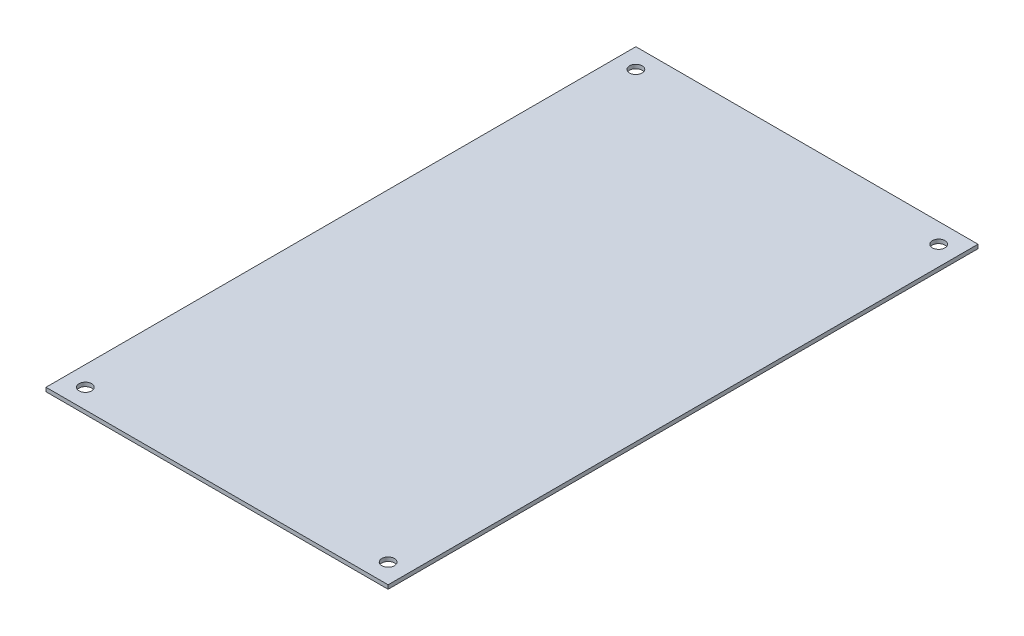
ISO-10303-21;
HEADER;
FILE_DESCRIPTION(('STEP AP214'),'2;1');
FILE_NAME('part.step','',(''),(''),'','','');
FILE_SCHEMA(('AUTOMOTIVE_DESIGN { 1 0 10303 214 1 1 1 1 }'));
ENDSEC;
DATA;
#1=APPLICATION_CONTEXT('core data for automotive mechanical design processes');
#2=APPLICATION_PROTOCOL_DEFINITION('international standard','automotive_design',2000,#1);
#3=PRODUCT_CONTEXT('',#1,'mechanical');
#4=PRODUCT('Part','Part','',(#3));
#5=PRODUCT_RELATED_PRODUCT_CATEGORY('part','',(#4));
#6=PRODUCT_DEFINITION_FORMATION('','',#4);
#7=PRODUCT_DEFINITION_CONTEXT('part definition',#1,'design');
#8=PRODUCT_DEFINITION('design','',#6,#7);
#9=PRODUCT_DEFINITION_SHAPE('','',#8);
#10=(LENGTH_UNIT() NAMED_UNIT(*) SI_UNIT(.MILLI.,.METRE.));
#11=(NAMED_UNIT(*) PLANE_ANGLE_UNIT() SI_UNIT($,.RADIAN.));
#12=(NAMED_UNIT(*) SI_UNIT($,.STERADIAN.) SOLID_ANGLE_UNIT());
#13=UNCERTAINTY_MEASURE_WITH_UNIT(LENGTH_MEASURE(1.E-05),#10,'distance_accuracy_value','');
#14=(GEOMETRIC_REPRESENTATION_CONTEXT(3) GLOBAL_UNCERTAINTY_ASSIGNED_CONTEXT((#13)) GLOBAL_UNIT_ASSIGNED_CONTEXT((#10,
#11,#12)) REPRESENTATION_CONTEXT('',''));
#15=CARTESIAN_POINT('',(0.,0.,0.));
#16=DIRECTION('',(0.,0.,1.));
#17=DIRECTION('',(1.,0.,0.));
#18=AXIS2_PLACEMENT_3D('',#15,#16,#17);
#19=CARTESIAN_POINT('',(-43.5,1.,0.));
#20=DIRECTION('',(-1.,0.,0.));
#21=DIRECTION('',(0.,0.,1.));
#22=AXIS2_PLACEMENT_3D('',#19,#20,#21);
#23=PLANE('',#22);
#24=DIRECTION('',(0.,0.,-1.));
#25=VECTOR('',#24,1.);
#26=CARTESIAN_POINT('',(-43.5,0.,0.));
#27=LINE('',#26,#25);
#28=CARTESIAN_POINT('',(-43.5,0.,75.));
#29=VERTEX_POINT('',#28);
#30=CARTESIAN_POINT('',(-43.5,0.,-75.));
#31=VERTEX_POINT('',#30);
#32=EDGE_CURVE('E114',#29,#31,#27,.T.);
#33=ORIENTED_EDGE('',*,*,#32,.F.);
#34=DIRECTION('',(0.,-1.,0.));
#35=VECTOR('',#34,1.);
#36=CARTESIAN_POINT('',(-43.5,1.,75.));
#37=LINE('',#36,#35);
#38=CARTESIAN_POINT('',(-43.5,1.,75.));
#39=VERTEX_POINT('',#38);
#40=EDGE_CURVE('E11',#39,#29,#37,.T.);
#41=ORIENTED_EDGE('',*,*,#40,.F.);
#42=DIRECTION('',(0.,0.,-1.));
#43=VECTOR('',#42,1.);
#44=CARTESIAN_POINT('',(-43.5,1.,0.));
#45=LINE('',#44,#43);
#46=CARTESIAN_POINT('',(-43.5,1.,-75.));
#47=VERTEX_POINT('',#46);
#48=EDGE_CURVE('E98',#39,#47,#45,.T.);
#49=ORIENTED_EDGE('',*,*,#48,.T.);
#50=DIRECTION('',(0.,-1.,0.));
#51=VECTOR('',#50,1.);
#52=CARTESIAN_POINT('',(-43.5,1.,-75.));
#53=LINE('',#52,#51);
#54=EDGE_CURVE('E60',#47,#31,#53,.T.);
#55=ORIENTED_EDGE('',*,*,#54,.T.);
#56=EDGE_LOOP('',(#33,#41,#49,#55));
#57=FACE_BOUND('',#56,.T.);
#58=ADVANCED_FACE('F43',(#57),#23,.T.);
#59=CARTESIAN_POINT('',(0.,1.,75.));
#60=DIRECTION('',(0.,0.,-1.));
#61=DIRECTION('',(-1.,0.,0.));
#62=AXIS2_PLACEMENT_3D('',#59,#60,#61);
#63=PLANE('',#62);
#64=DIRECTION('',(1.,0.,0.));
#65=VECTOR('',#64,1.);
#66=CARTESIAN_POINT('',(0.,0.,75.));
#67=LINE('',#66,#65);
#68=CARTESIAN_POINT('',(43.5,0.,75.));
#69=VERTEX_POINT('',#68);
#70=EDGE_CURVE('E103',#29,#69,#67,.T.);
#71=ORIENTED_EDGE('',*,*,#70,.T.);
#72=DIRECTION('',(0.,-1.,0.));
#73=VECTOR('',#72,1.);
#74=CARTESIAN_POINT('',(43.5,1.,75.));
#75=LINE('',#74,#73);
#76=CARTESIAN_POINT('',(43.5,1.,75.));
#77=VERTEX_POINT('',#76);
#78=EDGE_CURVE('E52',#77,#69,#75,.T.);
#79=ORIENTED_EDGE('',*,*,#78,.F.);
#80=DIRECTION('',(1.,0.,0.));
#81=VECTOR('',#80,1.);
#82=CARTESIAN_POINT('',(0.,1.,75.));
#83=LINE('',#82,#81);
#84=EDGE_CURVE('E94',#39,#77,#83,.T.);
#85=ORIENTED_EDGE('',*,*,#84,.F.);
#86=ORIENTED_EDGE('',*,*,#40,.T.);
#87=EDGE_LOOP('',(#71,#79,#85,#86));
#88=FACE_BOUND('',#87,.T.);
#89=ADVANCED_FACE('F101',(#88),#63,.F.);
#90=CARTESIAN_POINT('',(43.5,1.,0.));
#91=DIRECTION('',(-1.,0.,0.));
#92=DIRECTION('',(0.,0.,1.));
#93=AXIS2_PLACEMENT_3D('',#90,#91,#92);
#94=PLANE('',#93);
#95=DIRECTION('',(0.,0.,-1.));
#96=VECTOR('',#95,1.);
#97=CARTESIAN_POINT('',(43.5,0.,0.));
#98=LINE('',#97,#96);
#99=CARTESIAN_POINT('',(43.5,0.,-75.));
#100=VERTEX_POINT('',#99);
#101=EDGE_CURVE('E111',#69,#100,#98,.T.);
#102=ORIENTED_EDGE('',*,*,#101,.T.);
#103=DIRECTION('',(0.,-1.,0.));
#104=VECTOR('',#103,1.);
#105=CARTESIAN_POINT('',(43.5,1.,-75.));
#106=LINE('',#105,#104);
#107=CARTESIAN_POINT('',(43.5,1.,-75.));
#108=VERTEX_POINT('',#107);
#109=EDGE_CURVE('E74',#108,#100,#106,.T.);
#110=ORIENTED_EDGE('',*,*,#109,.F.);
#111=DIRECTION('',(0.,0.,-1.));
#112=VECTOR('',#111,1.);
#113=CARTESIAN_POINT('',(43.5,1.,0.));
#114=LINE('',#113,#112);
#115=EDGE_CURVE('E86',#77,#108,#114,.T.);
#116=ORIENTED_EDGE('',*,*,#115,.F.);
#117=ORIENTED_EDGE('',*,*,#78,.T.);
#118=EDGE_LOOP('',(#102,#110,#116,#117));
#119=FACE_BOUND('',#118,.T.);
#120=ADVANCED_FACE('F88',(#119),#94,.F.);
#121=CARTESIAN_POINT('',(-38.5,1.,-70.));
#122=DIRECTION('',(0.,-1.,0.));
#123=DIRECTION('',(0.,0.,-1.));
#124=AXIS2_PLACEMENT_3D('',#121,#122,#123);
#125=CYLINDRICAL_SURFACE('',#124,1.6);
#126=CARTESIAN_POINT('',(-38.5,1.,-70.));
#127=DIRECTION('',(0.,1.,0.));
#128=DIRECTION('',(0.,0.,1.));
#129=AXIS2_PLACEMENT_3D('',#126,#127,#128);
#130=CIRCLE('',#129,1.6);
#131=CARTESIAN_POINT('',(-38.5,1.,-68.4));
#132=VERTEX_POINT('',#131);
#133=EDGE_CURVE('E130',#132,#132,#130,.T.);
#134=ORIENTED_EDGE('',*,*,#133,.T.);
#135=EDGE_LOOP('',(#134));
#136=FACE_BOUND('',#135,.T.);
#137=CARTESIAN_POINT('',(-38.5,0.,-70.));
#138=DIRECTION('',(0.,1.,0.));
#139=DIRECTION('',(0.,0.,1.));
#140=AXIS2_PLACEMENT_3D('',#137,#138,#139);
#141=CIRCLE('',#140,1.6);
#142=CARTESIAN_POINT('',(-38.5,0.,-68.4));
#143=VERTEX_POINT('',#142);
#144=EDGE_CURVE('E116',#143,#143,#141,.T.);
#145=ORIENTED_EDGE('',*,*,#144,.F.);
#146=EDGE_LOOP('',(#145));
#147=FACE_BOUND('',#146,.T.);
#148=ADVANCED_FACE('F155',(#136,#147),#125,.F.);
#149=CARTESIAN_POINT('',(-38.5,1.,70.));
#150=DIRECTION('',(0.,-1.,0.));
#151=DIRECTION('',(0.,0.,-1.));
#152=AXIS2_PLACEMENT_3D('',#149,#150,#151);
#153=CYLINDRICAL_SURFACE('',#152,1.6);
#154=CARTESIAN_POINT('',(-38.5,1.,70.));
#155=DIRECTION('',(0.,1.,0.));
#156=DIRECTION('',(0.,0.,1.));
#157=AXIS2_PLACEMENT_3D('',#154,#155,#156);
#158=CIRCLE('',#157,1.6);
#159=CARTESIAN_POINT('',(-38.5,1.,71.6));
#160=VERTEX_POINT('',#159);
#161=EDGE_CURVE('E133',#160,#160,#158,.T.);
#162=ORIENTED_EDGE('',*,*,#161,.T.);
#163=EDGE_LOOP('',(#162));
#164=FACE_BOUND('',#163,.T.);
#165=CARTESIAN_POINT('',(-38.5,0.,70.));
#166=DIRECTION('',(0.,1.,0.));
#167=DIRECTION('',(0.,0.,1.));
#168=AXIS2_PLACEMENT_3D('',#165,#166,#167);
#169=CIRCLE('',#168,1.6);
#170=CARTESIAN_POINT('',(-38.5,0.,71.6));
#171=VERTEX_POINT('',#170);
#172=EDGE_CURVE('E119',#171,#171,#169,.T.);
#173=ORIENTED_EDGE('',*,*,#172,.F.);
#174=EDGE_LOOP('',(#173));
#175=FACE_BOUND('',#174,.T.);
#176=ADVANCED_FACE('F158',(#164,#175),#153,.F.);
#177=CARTESIAN_POINT('',(38.5,1.,-70.));
#178=DIRECTION('',(0.,-1.,0.));
#179=DIRECTION('',(0.,0.,-1.));
#180=AXIS2_PLACEMENT_3D('',#177,#178,#179);
#181=CYLINDRICAL_SURFACE('',#180,1.6);
#182=CARTESIAN_POINT('',(38.5,1.,-70.));
#183=DIRECTION('',(0.,1.,0.));
#184=DIRECTION('',(0.,0.,1.));
#185=AXIS2_PLACEMENT_3D('',#182,#183,#184);
#186=CIRCLE('',#185,1.6);
#187=CARTESIAN_POINT('',(38.5,1.,-68.4));
#188=VERTEX_POINT('',#187);
#189=EDGE_CURVE('E136',#188,#188,#186,.T.);
#190=ORIENTED_EDGE('',*,*,#189,.T.);
#191=EDGE_LOOP('',(#190));
#192=FACE_BOUND('',#191,.T.);
#193=CARTESIAN_POINT('',(38.5,0.,-70.));
#194=DIRECTION('',(0.,1.,0.));
#195=DIRECTION('',(0.,0.,1.));
#196=AXIS2_PLACEMENT_3D('',#193,#194,#195);
#197=CIRCLE('',#196,1.6);
#198=CARTESIAN_POINT('',(38.5,0.,-68.4));
#199=VERTEX_POINT('',#198);
#200=EDGE_CURVE('E122',#199,#199,#197,.T.);
#201=ORIENTED_EDGE('',*,*,#200,.F.);
#202=EDGE_LOOP('',(#201));
#203=FACE_BOUND('',#202,.T.);
#204=ADVANCED_FACE('F171',(#192,#203),#181,.F.);
#205=CARTESIAN_POINT('',(38.5,1.,70.));
#206=DIRECTION('',(0.,-1.,0.));
#207=DIRECTION('',(0.,0.,-1.));
#208=AXIS2_PLACEMENT_3D('',#205,#206,#207);
#209=CYLINDRICAL_SURFACE('',#208,1.6);
#210=CARTESIAN_POINT('',(38.5,1.,70.));
#211=DIRECTION('',(0.,1.,0.));
#212=DIRECTION('',(0.,0.,1.));
#213=AXIS2_PLACEMENT_3D('',#210,#211,#212);
#214=CIRCLE('',#213,1.6);
#215=CARTESIAN_POINT('',(38.5,1.,71.6));
#216=VERTEX_POINT('',#215);
#217=EDGE_CURVE('E110',#216,#216,#214,.T.);
#218=ORIENTED_EDGE('',*,*,#217,.T.);
#219=EDGE_LOOP('',(#218));
#220=FACE_BOUND('',#219,.T.);
#221=CARTESIAN_POINT('',(38.5,0.,70.));
#222=DIRECTION('',(0.,1.,0.));
#223=DIRECTION('',(0.,0.,1.));
#224=AXIS2_PLACEMENT_3D('',#221,#222,#223);
#225=CIRCLE('',#224,1.6);
#226=CARTESIAN_POINT('',(38.5,0.,71.6));
#227=VERTEX_POINT('',#226);
#228=EDGE_CURVE('E125',#227,#227,#225,.T.);
#229=ORIENTED_EDGE('',*,*,#228,.F.);
#230=EDGE_LOOP('',(#229));
#231=FACE_BOUND('',#230,.T.);
#232=ADVANCED_FACE('F45',(#220,#231),#209,.F.);
#233=CARTESIAN_POINT('',(0.,1.,-75.));
#234=DIRECTION('',(0.,0.,-1.));
#235=DIRECTION('',(-1.,0.,0.));
#236=AXIS2_PLACEMENT_3D('',#233,#234,#235);
#237=PLANE('',#236);
#238=DIRECTION('',(1.,0.,0.));
#239=VECTOR('',#238,1.);
#240=CARTESIAN_POINT('',(0.,0.,-75.));
#241=LINE('',#240,#239);
#242=EDGE_CURVE('E107',#31,#100,#241,.T.);
#243=ORIENTED_EDGE('',*,*,#242,.F.);
#244=ORIENTED_EDGE('',*,*,#54,.F.);
#245=DIRECTION('',(1.,0.,0.));
#246=VECTOR('',#245,1.);
#247=CARTESIAN_POINT('',(0.,1.,-75.));
#248=LINE('',#247,#246);
#249=EDGE_CURVE('E93',#47,#108,#248,.T.);
#250=ORIENTED_EDGE('',*,*,#249,.T.);
#251=ORIENTED_EDGE('',*,*,#109,.T.);
#252=EDGE_LOOP('',(#243,#244,#250,#251));
#253=FACE_BOUND('',#252,.T.);
#254=ADVANCED_FACE('F147',(#253),#237,.T.);
#255=CARTESIAN_POINT('',(0.,1.,0.));
#256=DIRECTION('',(0.,1.,0.));
#257=DIRECTION('',(0.,0.,1.));
#258=AXIS2_PLACEMENT_3D('',#255,#256,#257);
#259=PLANE('',#258);
#260=ORIENTED_EDGE('',*,*,#217,.F.);
#261=EDGE_LOOP('',(#260));
#262=FACE_BOUND('',#261,.T.);
#263=ORIENTED_EDGE('',*,*,#189,.F.);
#264=EDGE_LOOP('',(#263));
#265=FACE_BOUND('',#264,.T.);
#266=ORIENTED_EDGE('',*,*,#161,.F.);
#267=EDGE_LOOP('',(#266));
#268=FACE_BOUND('',#267,.T.);
#269=ORIENTED_EDGE('',*,*,#133,.F.);
#270=EDGE_LOOP('',(#269));
#271=FACE_BOUND('',#270,.T.);
#272=ORIENTED_EDGE('',*,*,#48,.F.);
#273=ORIENTED_EDGE('',*,*,#84,.T.);
#274=ORIENTED_EDGE('',*,*,#115,.T.);
#275=ORIENTED_EDGE('',*,*,#249,.F.);
#276=EDGE_LOOP('',(#272,#273,#274,#275));
#277=FACE_BOUND('',#276,.T.);
#278=ADVANCED_FACE('F97',(#262,#265,#268,#271,#277),#259,.T.);
#279=CARTESIAN_POINT('',(0.,0.,0.));
#280=DIRECTION('',(0.,1.,0.));
#281=DIRECTION('',(0.,0.,1.));
#282=AXIS2_PLACEMENT_3D('',#279,#280,#281);
#283=PLANE('',#282);
#284=ORIENTED_EDGE('',*,*,#228,.T.);
#285=EDGE_LOOP('',(#284));
#286=FACE_BOUND('',#285,.T.);
#287=ORIENTED_EDGE('',*,*,#200,.T.);
#288=EDGE_LOOP('',(#287));
#289=FACE_BOUND('',#288,.T.);
#290=ORIENTED_EDGE('',*,*,#172,.T.);
#291=EDGE_LOOP('',(#290));
#292=FACE_BOUND('',#291,.T.);
#293=ORIENTED_EDGE('',*,*,#144,.T.);
#294=EDGE_LOOP('',(#293));
#295=FACE_BOUND('',#294,.T.);
#296=ORIENTED_EDGE('',*,*,#32,.T.);
#297=ORIENTED_EDGE('',*,*,#242,.T.);
#298=ORIENTED_EDGE('',*,*,#101,.F.);
#299=ORIENTED_EDGE('',*,*,#70,.F.);
#300=EDGE_LOOP('',(#296,#297,#298,#299));
#301=FACE_BOUND('',#300,.T.);
#302=ADVANCED_FACE('F146',(#286,#289,#292,#295,#301),#283,.F.);
#303=CLOSED_SHELL('',(#58,#89,#120,#148,#176,#204,#232,#254,#278,#302));
#304=MANIFOLD_SOLID_BREP('B2',#303);
#305=ADVANCED_BREP_SHAPE_REPRESENTATION('',(#18,#304),#14);
#306=SHAPE_DEFINITION_REPRESENTATION(#9,#305);
ENDSEC;
END-ISO-10303-21;
